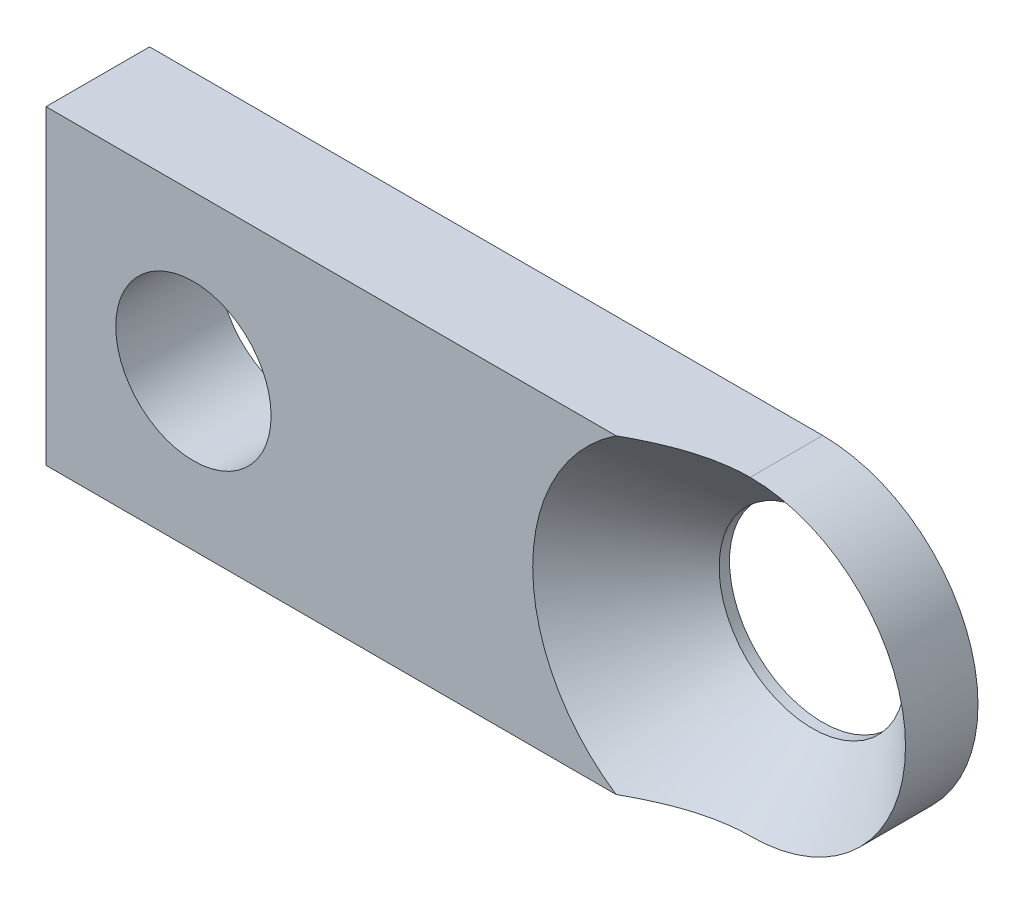
ISO-10303-21;
HEADER;
FILE_DESCRIPTION(('STEP AP214'),'2;1');
FILE_NAME('part.step','',(''),(''),'','','');
FILE_SCHEMA(('AUTOMOTIVE_DESIGN { 1 0 10303 214 1 1 1 1 }'));
ENDSEC;
DATA;
#1=APPLICATION_CONTEXT('core data for automotive mechanical design processes');
#2=APPLICATION_PROTOCOL_DEFINITION('international standard','automotive_design',2000,#1);
#3=PRODUCT_CONTEXT('',#1,'mechanical');
#4=PRODUCT('Part','Part','',(#3));
#5=PRODUCT_RELATED_PRODUCT_CATEGORY('part','',(#4));
#6=PRODUCT_DEFINITION_FORMATION('','',#4);
#7=PRODUCT_DEFINITION_CONTEXT('part definition',#1,'design');
#8=PRODUCT_DEFINITION('design','',#6,#7);
#9=PRODUCT_DEFINITION_SHAPE('','',#8);
#10=(LENGTH_UNIT() NAMED_UNIT(*) SI_UNIT(.MILLI.,.METRE.));
#11=(NAMED_UNIT(*) PLANE_ANGLE_UNIT() SI_UNIT($,.RADIAN.));
#12=(NAMED_UNIT(*) SI_UNIT($,.STERADIAN.) SOLID_ANGLE_UNIT());
#13=UNCERTAINTY_MEASURE_WITH_UNIT(LENGTH_MEASURE(1.E-05),#10,'distance_accuracy_value','');
#14=(GEOMETRIC_REPRESENTATION_CONTEXT(3) GLOBAL_UNCERTAINTY_ASSIGNED_CONTEXT((#13)) GLOBAL_UNIT_ASSIGNED_CONTEXT((#10,
#11,#12)) REPRESENTATION_CONTEXT('',''));
#15=CARTESIAN_POINT('',(0.,0.,0.));
#16=DIRECTION('',(0.,0.,1.));
#17=DIRECTION('',(1.,0.,0.));
#18=AXIS2_PLACEMENT_3D('',#15,#16,#17);
#19=CARTESIAN_POINT('',(1.7765014720012,0.,0.));
#20=DIRECTION('',(0.,0.,1.));
#21=DIRECTION('',(1.,0.,0.));
#22=AXIS2_PLACEMENT_3D('',#19,#20,#21);
#23=PLANE('',#22);
#24=CARTESIAN_POINT('',(1.7765014720012,0.,0.));
#25=DIRECTION('',(0.,0.,1.));
#26=DIRECTION('',(1.,0.,0.));
#27=AXIS2_PLACEMENT_3D('',#24,#25,#26);
#28=CIRCLE('',#27,0.9);
#29=CARTESIAN_POINT('',(2.6765014720012,0.,0.));
#30=VERTEX_POINT('',#29);
#31=EDGE_CURVE('E184',#30,#30,#28,.T.);
#32=ORIENTED_EDGE('',*,*,#31,.T.);
#33=EDGE_LOOP('',(#32));
#34=FACE_BOUND('',#33,.T.);
#35=CARTESIAN_POINT('',(1.7765014720012,0.,0.));
#36=DIRECTION('',(0.,0.,1.));
#37=DIRECTION('',(1.,0.,0.));
#38=AXIS2_PLACEMENT_3D('',#35,#36,#37);
#39=CIRCLE('',#38,1.5);
#40=CARTESIAN_POINT('',(1.7765014720012,-1.5,0.));
#41=VERTEX_POINT('',#40);
#42=CARTESIAN_POINT('',(1.7765014720012,1.5,0.));
#43=VERTEX_POINT('',#42);
#44=EDGE_CURVE('E115',#41,#43,#39,.T.);
#45=ORIENTED_EDGE('',*,*,#44,.F.);
#46=DIRECTION('',(1.,0.,0.));
#47=VECTOR('',#46,1.);
#48=CARTESIAN_POINT('',(1.7765014720012,-1.5,0.));
#49=LINE('',#48,#47);
#50=CARTESIAN_POINT('',(-4.7234985279988,-1.5,0.));
#51=VERTEX_POINT('',#50);
#52=EDGE_CURVE('E107',#51,#41,#49,.T.);
#53=ORIENTED_EDGE('',*,*,#52,.F.);
#54=DIRECTION('',(0.,-1.,0.));
#55=VECTOR('',#54,1.);
#56=CARTESIAN_POINT('',(-4.7234985279988,-1.5,0.));
#57=LINE('',#56,#55);
#58=CARTESIAN_POINT('',(-4.7234985279988,1.5,0.));
#59=VERTEX_POINT('',#58);
#60=EDGE_CURVE('E124',#59,#51,#57,.T.);
#61=ORIENTED_EDGE('',*,*,#60,.F.);
#62=DIRECTION('',(-1.,0.,0.));
#63=VECTOR('',#62,1.);
#64=CARTESIAN_POINT('',(1.7765014720012,1.5,0.));
#65=LINE('',#64,#63);
#66=EDGE_CURVE('E110',#43,#59,#65,.T.);
#67=ORIENTED_EDGE('',*,*,#66,.F.);
#68=EDGE_LOOP('',(#45,#53,#61,#67));
#69=FACE_BOUND('',#68,.T.);
#70=CARTESIAN_POINT('',(-3.29999999999948,0.,0.));
#71=DIRECTION('',(0.,0.,-1.));
#72=DIRECTION('',(-1.,0.,0.));
#73=AXIS2_PLACEMENT_3D('',#70,#71,#72);
#74=CIRCLE('',#73,0.749999999999999);
#75=CARTESIAN_POINT('',(-4.04999999999947,0.,0.));
#76=VERTEX_POINT('',#75);
#77=EDGE_CURVE('E151',#76,#76,#74,.T.);
#78=ORIENTED_EDGE('',*,*,#77,.F.);
#79=EDGE_LOOP('',(#78));
#80=FACE_BOUND('',#79,.T.);
#81=ADVANCED_FACE('F37',(#34,#69,#80),#23,.F.);
#82=CARTESIAN_POINT('',(1.7765014720012,0.,1.));
#83=DIRECTION('',(0.,0.,-1.));
#84=DIRECTION('',(-1.,0.,0.));
#85=AXIS2_PLACEMENT_3D('',#82,#83,#84);
#86=CYLINDRICAL_SURFACE('',#85,1.5);
#87=DIRECTION('',(0.,0.,-1.));
#88=VECTOR('',#87,1.);
#89=CARTESIAN_POINT('',(1.7765014720012,1.5,1.));
#90=LINE('',#89,#88);
#91=CARTESIAN_POINT('',(1.7765014720012,1.5,0.700000000000002));
#92=VERTEX_POINT('',#91);
#93=EDGE_CURVE('E50',#92,#43,#90,.T.);
#94=ORIENTED_EDGE('',*,*,#93,.F.);
#95=CARTESIAN_POINT('',(1.7765014720012,0.,0.700000000000002));
#96=DIRECTION('',(0.,0.,1.));
#97=DIRECTION('',(1.,0.,0.));
#98=AXIS2_PLACEMENT_3D('',#95,#96,#97);
#99=CIRCLE('',#98,1.5);
#100=CARTESIAN_POINT('',(1.7765014720012,-1.5,0.700000000000002));
#101=VERTEX_POINT('',#100);
#102=EDGE_CURVE('E57',#92,#101,#99,.F.);
#103=ORIENTED_EDGE('',*,*,#102,.T.);
#104=DIRECTION('',(0.,0.,-1.));
#105=VECTOR('',#104,1.);
#106=CARTESIAN_POINT('',(1.7765014720012,-1.5,1.));
#107=LINE('',#106,#105);
#108=EDGE_CURVE('E63',#101,#41,#107,.T.);
#109=ORIENTED_EDGE('',*,*,#108,.T.);
#110=ORIENTED_EDGE('',*,*,#44,.T.);
#111=EDGE_LOOP('',(#94,#103,#109,#110));
#112=FACE_BOUND('',#111,.T.);
#113=ADVANCED_FACE('F39',(#112),#86,.T.);
#114=CARTESIAN_POINT('',(1.7765014720012,1.5,1.));
#115=DIRECTION('',(0.,-1.,0.));
#116=DIRECTION('',(1.,0.,0.));
#117=AXIS2_PLACEMENT_3D('',#114,#115,#116);
#118=PLANE('',#117);
#119=DIRECTION('',(-1.,0.,0.));
#120=VECTOR('',#119,1.);
#121=CARTESIAN_POINT('',(1.7765014720012,1.5,1.));
#122=LINE('',#121,#120);
#123=CARTESIAN_POINT('',(0.781514034894581,1.5,1.));
#124=VERTEX_POINT('',#123);
#125=CARTESIAN_POINT('',(-4.7234985279988,1.5,1.));
#126=VERTEX_POINT('',#125);
#127=EDGE_CURVE('E98',#124,#126,#122,.T.);
#128=ORIENTED_EDGE('',*,*,#127,.F.);
#129=CARTESIAN_POINT('',(-0.913236999470462,1.5,2.27972288443534));
#130=CARTESIAN_POINT('',(-0.849424042642534,1.5,2.22400078229108));
#131=CARTESIAN_POINT('',(-0.785386333000004,1.5,2.16853319734055));
#132=CARTESIAN_POINT('',(-0.65674164650633,1.5,2.05824403673661));
#133=CARTESIAN_POINT('',(-0.592134590145568,1.5,2.00342255389286));
#134=CARTESIAN_POINT('',(-0.461840454500137,1.5,1.89423569084242));
#135=CARTESIAN_POINT('',(-0.396149135701899,1.5,1.83987535832301));
#136=CARTESIAN_POINT('',(-0.263938470601512,1.5,1.73217761749969));
#137=CARTESIAN_POINT('',(-0.197419176790966,1.5,1.67884014488818));
#138=CARTESIAN_POINT('',(-0.0574457174480197,1.5,1.56882357658236));
#139=CARTESIAN_POINT('',(0.0161029581998046,1.5,1.51226426501268));
#140=CARTESIAN_POINT('',(0.164741228638048,1.5,1.40121052524075));
#141=CARTESIAN_POINT('',(0.239830675221931,1.5,1.34671589985867));
#142=CARTESIAN_POINT('',(0.391801062830171,1.5,1.2406949613161));
#143=CARTESIAN_POINT('',(0.468676886285067,1.5,1.18916135796578));
#144=CARTESIAN_POINT('',(0.624946676354186,1.5,1.09008430858854));
#145=CARTESIAN_POINT('',(0.704339362775737,1.5,1.04253887747945));
#146=CARTESIAN_POINT('',(0.839453713584291,1.5,0.968058207788584));
#147=CARTESIAN_POINT('',(0.894286718053485,1.5,0.939519697292481));
#148=CARTESIAN_POINT('',(1.00560952012635,1.5,0.885792225842832));
#149=CARTESIAN_POINT('',(1.06209976704134,1.5,0.860604183705091));
#150=CARTESIAN_POINT('',(1.17592030655501,1.5,0.814938393482084));
#151=CARTESIAN_POINT('',(1.2332223804008,1.5,0.79439126364325));
#152=CARTESIAN_POINT('',(1.3494583969716,1.5,0.758627145996873));
#153=CARTESIAN_POINT('',(1.40839099445934,1.5,0.74340589779457));
#154=CARTESIAN_POINT('',(1.51187470154734,1.5,0.722555903766044));
#155=CARTESIAN_POINT('',(1.5561295513538,1.5,0.715456950877967));
#156=CARTESIAN_POINT('',(1.64508985124529,1.5,0.705097908645165));
#157=CARTESIAN_POINT('',(1.68979524414235,1.5,0.701837338128475));
#158=CARTESIAN_POINT('',(1.77959404926238,1.5,0.699327631232823));
#159=CARTESIAN_POINT('',(1.82468816285399,1.5,0.700103138798732));
#160=CARTESIAN_POINT('',(1.9146178977611,1.5,0.70567610317253));
#161=CARTESIAN_POINT('',(1.9594535367799,1.5,0.710473281154396));
#162=CARTESIAN_POINT('',(2.05974741555344,1.5,0.725514042860606));
#163=CARTESIAN_POINT('',(2.11504582161193,1.5,0.736822809267089));
#164=CARTESIAN_POINT('',(2.22439736166606,1.5,0.764545957822539));
#165=CARTESIAN_POINT('',(2.27844870283326,1.5,0.780967251704753));
#166=CARTESIAN_POINT('',(2.38496719586545,1.5,0.81794145990781));
#167=CARTESIAN_POINT('',(2.43743735174805,1.5,0.838485885968966));
#168=CARTESIAN_POINT('',(2.54077095096234,1.5,0.882840683561282));
#169=CARTESIAN_POINT('',(2.59163935611269,1.5,0.906639424614922));
#170=CARTESIAN_POINT('',(2.64182091094571,1.5,0.931697933074718));
#171=B_SPLINE_CURVE_WITH_KNOTS('',3,(#129,#130,#131,#132,#133,#134,#135,#136,#137,#138,#139,
#140,#141,#142,#143,#144,#145,#146,#147,#148,#149,#150,#151,#152,#153,#154,#155,#156,#157,#158,
#159,#160,#161,#162,#163,#164,#165,#166,#167,#168,#169,#170),.UNSPECIFIED.,.F.,.F.,(4,2,2,2,2,2,
2,2,2,2,2,2,2,2,2,2,2,2,2,2,4),(0.,0.254154476740828,0.508345027244253,0.76413661824886,
1.0199120744592,1.29822964277969,1.57652056412079,1.85409404558775,2.13152853685833,
2.31688860337514,2.50229939777702,2.68472151110009,2.86699736194438,3.00130964149288,
3.13560508212821,3.27072147757043,3.40582850604621,3.57486349287806,3.74412800131956,
3.91304755625958,4.08137846911918),.UNSPECIFIED.);
#172=EDGE_CURVE('E11',#124,#92,#171,.T.);
#173=ORIENTED_EDGE('',*,*,#172,.T.);
#174=ORIENTED_EDGE('',*,*,#93,.T.);
#175=ORIENTED_EDGE('',*,*,#66,.T.);
#176=DIRECTION('',(0.,0.,-1.));
#177=VECTOR('',#176,1.);
#178=CARTESIAN_POINT('',(-4.7234985279988,1.5,0.));
#179=LINE('',#178,#177);
#180=EDGE_CURVE('E106',#126,#59,#179,.T.);
#181=ORIENTED_EDGE('',*,*,#180,.F.);
#182=EDGE_LOOP('',(#128,#173,#174,#175,#181));
#183=FACE_BOUND('',#182,.T.);
#184=ADVANCED_FACE('F104',(#183),#118,.F.);
#185=CARTESIAN_POINT('',(1.7765014720012,-1.5,1.));
#186=DIRECTION('',(0.,1.,0.));
#187=DIRECTION('',(-1.,0.,0.));
#188=AXIS2_PLACEMENT_3D('',#185,#186,#187);
#189=PLANE('',#188);
#190=ORIENTED_EDGE('',*,*,#108,.F.);
#191=CARTESIAN_POINT('',(-0.913236999470463,-1.5,2.27972288443534));
#192=CARTESIAN_POINT('',(-0.849424042642535,-1.5,2.22400078229108));
#193=CARTESIAN_POINT('',(-0.785386333000004,-1.5,2.16853319734055));
#194=CARTESIAN_POINT('',(-0.656741646506331,-1.5,2.05824403673661));
#195=CARTESIAN_POINT('',(-0.592134590145568,-1.5,2.00342255389286));
#196=CARTESIAN_POINT('',(-0.461840454500138,-1.5,1.89423569084242));
#197=CARTESIAN_POINT('',(-0.3961491357019,-1.5,1.83987535832301));
#198=CARTESIAN_POINT('',(-0.263938470601513,-1.5,1.73217761749969));
#199=CARTESIAN_POINT('',(-0.197419176790967,-1.5,1.67884014488818));
#200=CARTESIAN_POINT('',(-0.0574457174480203,-1.5,1.56882357658236));
#201=CARTESIAN_POINT('',(0.016102958199804,-1.5,1.51226426501268));
#202=CARTESIAN_POINT('',(0.164741228638047,-1.5,1.40121052524075));
#203=CARTESIAN_POINT('',(0.23983067522193,-1.5,1.34671589985867));
#204=CARTESIAN_POINT('',(0.391801062830171,-1.5,1.2406949613161));
#205=CARTESIAN_POINT('',(0.468676886285067,-1.5,1.18916135796578));
#206=CARTESIAN_POINT('',(0.624946676354186,-1.5,1.09008430858854));
#207=CARTESIAN_POINT('',(0.704339362775737,-1.5,1.04253887747945));
#208=CARTESIAN_POINT('',(0.839453713584291,-1.5,0.968058207788584));
#209=CARTESIAN_POINT('',(0.894286718053485,-1.5,0.939519697292482));
#210=CARTESIAN_POINT('',(1.00560952012635,-1.5,0.885792225842833));
#211=CARTESIAN_POINT('',(1.06209976704134,-1.5,0.860604183705092));
#212=CARTESIAN_POINT('',(1.17592030655501,-1.5,0.814938393482085));
#213=CARTESIAN_POINT('',(1.23322238040081,-1.5,0.79439126364325));
#214=CARTESIAN_POINT('',(1.3494583969716,-1.5,0.758627145996874));
#215=CARTESIAN_POINT('',(1.40839099445934,-1.5,0.743405897794571));
#216=CARTESIAN_POINT('',(1.51187470154734,-1.5,0.722555903766044));
#217=CARTESIAN_POINT('',(1.5561295513538,-1.5,0.715456950877968));
#218=CARTESIAN_POINT('',(1.64508985124529,-1.5,0.705097908645165));
#219=CARTESIAN_POINT('',(1.68979524414235,-1.5,0.701837338128476));
#220=CARTESIAN_POINT('',(1.77959404926238,-1.5,0.699327631232824));
#221=CARTESIAN_POINT('',(1.82468816285399,-1.5,0.700103138798733));
#222=CARTESIAN_POINT('',(1.9146178977611,-1.5,0.705676103172531));
#223=CARTESIAN_POINT('',(1.9594535367799,-1.5,0.710473281154397));
#224=CARTESIAN_POINT('',(2.05974741555344,-1.5,0.725514042860607));
#225=CARTESIAN_POINT('',(2.11504582161193,-1.5,0.73682280926709));
#226=CARTESIAN_POINT('',(2.22439736166606,-1.5,0.76454595782254));
#227=CARTESIAN_POINT('',(2.27844870283326,-1.5,0.780967251704754));
#228=CARTESIAN_POINT('',(2.38496719586545,-1.5,0.817941459907811));
#229=CARTESIAN_POINT('',(2.43743735174805,-1.5,0.838485885968967));
#230=CARTESIAN_POINT('',(2.54077095096235,-1.5,0.882840683561283));
#231=CARTESIAN_POINT('',(2.59163935611269,-1.5,0.906639424614923));
#232=CARTESIAN_POINT('',(2.64182091094571,-1.5,0.931697933074719));
#233=B_SPLINE_CURVE_WITH_KNOTS('',3,(#191,#192,#193,#194,#195,#196,#197,#198,#199,#200,#201,
#202,#203,#204,#205,#206,#207,#208,#209,#210,#211,#212,#213,#214,#215,#216,#217,#218,#219,#220,
#221,#222,#223,#224,#225,#226,#227,#228,#229,#230,#231,#232),.UNSPECIFIED.,.F.,.F.,(4,2,2,2,2,2,
2,2,2,2,2,2,2,2,2,2,2,2,2,2,4),(0.,0.254154476740828,0.508345027244252,0.764136618248859,
1.01991207445919,1.29822964277969,1.57652056412079,1.85409404558775,2.13152853685833,
2.31688860337514,2.50229939777702,2.68472151110009,2.86699736194438,3.00130964149288,
3.13560508212821,3.27072147757043,3.40582850604621,3.57486349287807,3.74412800131956,
3.91304755625959,4.08137846911918),.UNSPECIFIED.);
#234=CARTESIAN_POINT('',(0.781514034894582,-1.5,1.));
#235=VERTEX_POINT('',#234);
#236=EDGE_CURVE('E144',#101,#235,#233,.F.);
#237=ORIENTED_EDGE('',*,*,#236,.T.);
#238=DIRECTION('',(1.,0.,0.));
#239=VECTOR('',#238,1.);
#240=CARTESIAN_POINT('',(1.7765014720012,-1.5,1.));
#241=LINE('',#240,#239);
#242=CARTESIAN_POINT('',(-4.7234985279988,-1.5,1.));
#243=VERTEX_POINT('',#242);
#244=EDGE_CURVE('E100',#243,#235,#241,.T.);
#245=ORIENTED_EDGE('',*,*,#244,.F.);
#246=DIRECTION('',(0.,0.,1.));
#247=VECTOR('',#246,1.);
#248=CARTESIAN_POINT('',(-4.7234985279988,-1.5,0.));
#249=LINE('',#248,#247);
#250=EDGE_CURVE('E174',#51,#243,#249,.T.);
#251=ORIENTED_EDGE('',*,*,#250,.F.);
#252=ORIENTED_EDGE('',*,*,#52,.T.);
#253=EDGE_LOOP('',(#190,#237,#245,#251,#252));
#254=FACE_BOUND('',#253,.T.);
#255=ADVANCED_FACE('F130',(#254),#189,.F.);
#256=CARTESIAN_POINT('',(1.7765014720012,0.,1.));
#257=DIRECTION('',(0.,0.,1.));
#258=DIRECTION('',(1.,0.,0.));
#259=AXIS2_PLACEMENT_3D('',#256,#257,#258);
#260=PLANE('',#259);
#261=CARTESIAN_POINT('',(1.7765014720012,0.,1.));
#262=DIRECTION('',(0.,0.,1.));
#263=DIRECTION('',(1.,0.,0.));
#264=AXIS2_PLACEMENT_3D('',#261,#262,#263);
#265=CIRCLE('',#264,1.8);
#266=EDGE_CURVE('E88',#124,#235,#265,.T.);
#267=ORIENTED_EDGE('',*,*,#266,.F.);
#268=ORIENTED_EDGE('',*,*,#127,.T.);
#269=DIRECTION('',(0.,1.,0.));
#270=VECTOR('',#269,1.);
#271=CARTESIAN_POINT('',(-4.7234985279988,-1.5,1.));
#272=LINE('',#271,#270);
#273=EDGE_CURVE('E177',#243,#126,#272,.T.);
#274=ORIENTED_EDGE('',*,*,#273,.F.);
#275=ORIENTED_EDGE('',*,*,#244,.T.);
#276=EDGE_LOOP('',(#267,#268,#274,#275));
#277=FACE_BOUND('',#276,.T.);
#278=CARTESIAN_POINT('',(-3.29999999999948,0.,1.));
#279=DIRECTION('',(0.,0.,1.));
#280=DIRECTION('',(1.,0.,0.));
#281=AXIS2_PLACEMENT_3D('',#278,#279,#280);
#282=CIRCLE('',#281,0.75);
#283=CARTESIAN_POINT('',(-2.54999999999948,0.,1.));
#284=VERTEX_POINT('',#283);
#285=EDGE_CURVE('E175',#284,#284,#282,.T.);
#286=ORIENTED_EDGE('',*,*,#285,.F.);
#287=EDGE_LOOP('',(#286));
#288=FACE_BOUND('',#287,.T.);
#289=ADVANCED_FACE('F95',(#277,#288),#260,.T.);
#290=CARTESIAN_POINT('',(-4.7234985279988,0.,0.));
#291=DIRECTION('',(1.,0.,0.));
#292=DIRECTION('',(0.,0.,-1.));
#293=AXIS2_PLACEMENT_3D('',#290,#291,#292);
#294=PLANE('',#293);
#295=ORIENTED_EDGE('',*,*,#60,.T.);
#296=ORIENTED_EDGE('',*,*,#250,.T.);
#297=ORIENTED_EDGE('',*,*,#273,.T.);
#298=ORIENTED_EDGE('',*,*,#180,.T.);
#299=EDGE_LOOP('',(#295,#296,#297,#298));
#300=FACE_BOUND('',#299,.T.);
#301=ADVANCED_FACE('F165',(#300),#294,.F.);
#302=CARTESIAN_POINT('',(-3.29999999999948,0.,0.));
#303=DIRECTION('',(0.,0.,-1.));
#304=DIRECTION('',(-1.,0.,0.));
#305=AXIS2_PLACEMENT_3D('',#302,#303,#304);
#306=CYLINDRICAL_SURFACE('',#305,0.75);
#307=ORIENTED_EDGE('',*,*,#77,.T.);
#308=EDGE_LOOP('',(#307));
#309=FACE_BOUND('',#308,.T.);
#310=ORIENTED_EDGE('',*,*,#285,.T.);
#311=EDGE_LOOP('',(#310));
#312=FACE_BOUND('',#311,.T.);
#313=ADVANCED_FACE('F158',(#309,#312),#306,.F.);
#314=CARTESIAN_POINT('',(1.7765014720012,0.,1.));
#315=DIRECTION('',(0.,0.,1.));
#316=DIRECTION('',(1.,0.,0.));
#317=AXIS2_PLACEMENT_3D('',#314,#315,#316);
#318=CONICAL_SURFACE('',#317,1.8,0.785398163397448);
#319=CARTESIAN_POINT('',(1.7765014720012,0.,0.100000000000001));
#320=DIRECTION('',(0.,0.,1.));
#321=DIRECTION('',(1.,0.,0.));
#322=AXIS2_PLACEMENT_3D('',#319,#320,#321);
#323=CIRCLE('',#322,0.899999999999999);
#324=CARTESIAN_POINT('',(2.6765014720012,0.,0.100000000000001));
#325=VERTEX_POINT('',#324);
#326=EDGE_CURVE('E101',#325,#325,#323,.T.);
#327=ORIENTED_EDGE('',*,*,#326,.F.);
#328=EDGE_LOOP('',(#327));
#329=FACE_BOUND('',#328,.T.);
#330=ORIENTED_EDGE('',*,*,#102,.F.);
#331=ORIENTED_EDGE('',*,*,#172,.F.);
#332=ORIENTED_EDGE('',*,*,#266,.T.);
#333=ORIENTED_EDGE('',*,*,#236,.F.);
#334=EDGE_LOOP('',(#330,#331,#332,#333));
#335=FACE_BOUND('',#334,.T.);
#336=ADVANCED_FACE('F87',(#329,#335),#318,.F.);
#337=CARTESIAN_POINT('',(1.7765014720012,0.,1.));
#338=DIRECTION('',(0.,0.,1.));
#339=DIRECTION('',(1.,0.,0.));
#340=AXIS2_PLACEMENT_3D('',#337,#338,#339);
#341=CYLINDRICAL_SURFACE('',#340,0.9);
#342=ORIENTED_EDGE('',*,*,#31,.F.);
#343=EDGE_LOOP('',(#342));
#344=FACE_BOUND('',#343,.T.);
#345=ORIENTED_EDGE('',*,*,#326,.T.);
#346=EDGE_LOOP('',(#345));
#347=FACE_BOUND('',#346,.T.);
#348=ADVANCED_FACE('F157',(#344,#347),#341,.F.);
#349=CLOSED_SHELL('',(#81,#113,#184,#255,#289,#301,#313,#336,#348));
#350=MANIFOLD_SOLID_BREP('B2',#349);
#351=ADVANCED_BREP_SHAPE_REPRESENTATION('',(#18,#350),#14);
#352=SHAPE_DEFINITION_REPRESENTATION(#9,#351);
ENDSEC;
END-ISO-10303-21;
